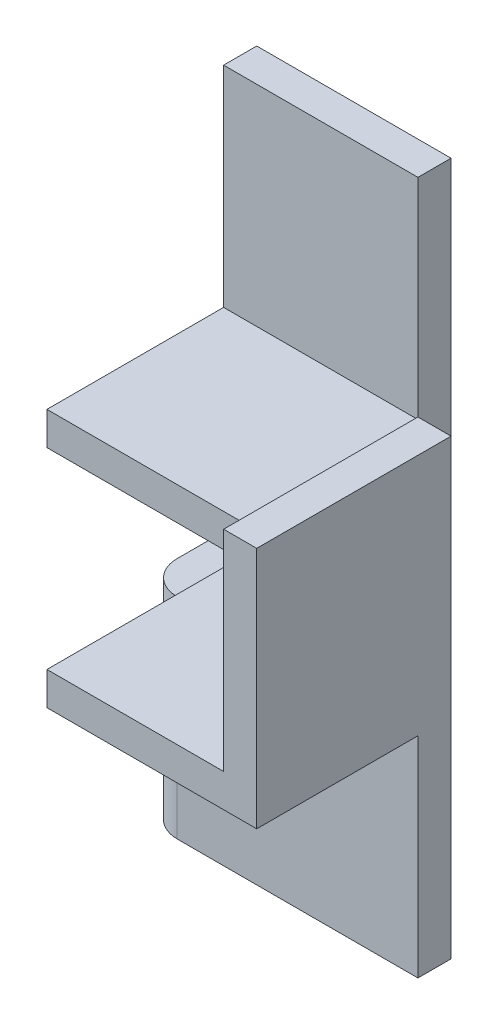
ISO-10303-21;
HEADER;
FILE_DESCRIPTION(('STEP AP214'),'2;1');
FILE_NAME('part.step','',(''),(''),'','','');
FILE_SCHEMA(('AUTOMOTIVE_DESIGN { 1 0 10303 214 1 1 1 1 }'));
ENDSEC;
DATA;
#1=APPLICATION_CONTEXT('core data for automotive mechanical design processes');
#2=APPLICATION_PROTOCOL_DEFINITION('international standard','automotive_design',2000,#1);
#3=PRODUCT_CONTEXT('',#1,'mechanical');
#4=PRODUCT('Part','Part','',(#3));
#5=PRODUCT_RELATED_PRODUCT_CATEGORY('part','',(#4));
#6=PRODUCT_DEFINITION_FORMATION('','',#4);
#7=PRODUCT_DEFINITION_CONTEXT('part definition',#1,'design');
#8=PRODUCT_DEFINITION('design','',#6,#7);
#9=PRODUCT_DEFINITION_SHAPE('','',#8);
#10=(LENGTH_UNIT() NAMED_UNIT(*) SI_UNIT(.MILLI.,.METRE.));
#11=(NAMED_UNIT(*) PLANE_ANGLE_UNIT() SI_UNIT($,.RADIAN.));
#12=(NAMED_UNIT(*) SI_UNIT($,.STERADIAN.) SOLID_ANGLE_UNIT());
#13=UNCERTAINTY_MEASURE_WITH_UNIT(LENGTH_MEASURE(1.E-05),#10,'distance_accuracy_value','');
#14=(GEOMETRIC_REPRESENTATION_CONTEXT(3) GLOBAL_UNCERTAINTY_ASSIGNED_CONTEXT((#13)) GLOBAL_UNIT_ASSIGNED_CONTEXT((#10,
#11,#12)) REPRESENTATION_CONTEXT('',''));
#15=CARTESIAN_POINT('',(0.,0.,0.));
#16=DIRECTION('',(0.,0.,1.));
#17=DIRECTION('',(1.,0.,0.));
#18=AXIS2_PLACEMENT_3D('',#15,#16,#17);
#19=CARTESIAN_POINT('',(0.,0.,0.));
#20=DIRECTION('',(0.,1.,0.));
#21=DIRECTION('',(0.,0.,1.));
#22=AXIS2_PLACEMENT_3D('',#19,#20,#21);
#23=PLANE('',#22);
#24=DIRECTION('',(0.,0.,-1.));
#25=VECTOR('',#24,1.);
#26=CARTESIAN_POINT('',(18.542,0.,0.));
#27=LINE('',#26,#25);
#28=CARTESIAN_POINT('',(18.542,0.,27.686));
#29=VERTEX_POINT('',#28);
#30=CARTESIAN_POINT('',(18.542,0.,24.13));
#31=VERTEX_POINT('',#30);
#32=EDGE_CURVE('E219',#29,#31,#27,.T.);
#33=ORIENTED_EDGE('',*,*,#32,.F.);
#34=CARTESIAN_POINT('',(22.352,0.,27.686));
#35=DIRECTION('',(0.,1.,0.));
#36=DIRECTION('',(0.,0.,1.));
#37=AXIS2_PLACEMENT_3D('',#34,#35,#36);
#38=CIRCLE('',#37,3.81);
#39=CARTESIAN_POINT('',(22.352,0.,31.496));
#40=VERTEX_POINT('',#39);
#41=EDGE_CURVE('E55',#29,#40,#38,.T.);
#42=ORIENTED_EDGE('',*,*,#41,.T.);
#43=DIRECTION('',(-1.,0.,0.));
#44=VECTOR('',#43,1.);
#45=CARTESIAN_POINT('',(50.038,0.,31.496));
#46=LINE('',#45,#44);
#47=CARTESIAN_POINT('',(25.908,0.,31.496));
#48=VERTEX_POINT('',#47);
#49=EDGE_CURVE('E235',#48,#40,#46,.T.);
#50=ORIENTED_EDGE('',*,*,#49,.F.);
#51=DIRECTION('',(0.,0.,1.));
#52=VECTOR('',#51,1.);
#53=CARTESIAN_POINT('',(25.908,0.,0.));
#54=LINE('',#53,#52);
#55=CARTESIAN_POINT('',(25.908,0.,27.686));
#56=VERTEX_POINT('',#55);
#57=EDGE_CURVE('E281',#56,#48,#54,.T.);
#58=ORIENTED_EDGE('',*,*,#57,.F.);
#59=DIRECTION('',(1.,0.,0.));
#60=VECTOR('',#59,1.);
#61=CARTESIAN_POINT('',(22.352,0.,27.686));
#62=LINE('',#61,#60);
#63=CARTESIAN_POINT('',(22.352,0.,27.686));
#64=VERTEX_POINT('',#63);
#65=EDGE_CURVE('E232',#64,#56,#62,.T.);
#66=ORIENTED_EDGE('',*,*,#65,.F.);
#67=DIRECTION('',(0.,0.,1.));
#68=VECTOR('',#67,1.);
#69=CARTESIAN_POINT('',(22.352,0.,0.));
#70=LINE('',#69,#68);
#71=CARTESIAN_POINT('',(22.352,0.,24.13));
#72=VERTEX_POINT('',#71);
#73=EDGE_CURVE('E214',#72,#64,#70,.T.);
#74=ORIENTED_EDGE('',*,*,#73,.F.);
#75=DIRECTION('',(1.,0.,0.));
#76=VECTOR('',#75,1.);
#77=CARTESIAN_POINT('',(0.,0.,24.13));
#78=LINE('',#77,#76);
#79=EDGE_CURVE('E200',#31,#72,#78,.T.);
#80=ORIENTED_EDGE('',*,*,#79,.F.);
#81=EDGE_LOOP('',(#33,#42,#50,#58,#66,#74,#80));
#82=FACE_BOUND('',#81,.T.);
#83=ADVANCED_FACE('F33',(#82),#23,.T.);
#84=CARTESIAN_POINT('',(0.,0.,0.));
#85=DIRECTION('',(0.,1.,0.));
#86=DIRECTION('',(0.,0.,1.));
#87=AXIS2_PLACEMENT_3D('',#84,#85,#86);
#88=PLANE('',#87);
#89=CARTESIAN_POINT('',(50.038,0.,31.496));
#90=VERTEX_POINT('',#89);
#91=EDGE_CURVE('E236',#90,#48,#46,.T.);
#92=ORIENTED_EDGE('',*,*,#91,.F.);
#93=DIRECTION('',(0.,0.,1.));
#94=VECTOR('',#93,1.);
#95=CARTESIAN_POINT('',(50.038,0.,0.));
#96=LINE('',#95,#94);
#97=CARTESIAN_POINT('',(50.038,0.,50.038));
#98=VERTEX_POINT('',#97);
#99=EDGE_CURVE('E269',#90,#98,#96,.T.);
#100=ORIENTED_EDGE('',*,*,#99,.T.);
#101=DIRECTION('',(1.,0.,0.));
#102=VECTOR('',#101,1.);
#103=CARTESIAN_POINT('',(0.,0.,50.038));
#104=LINE('',#103,#102);
#105=CARTESIAN_POINT('',(25.908,0.,50.038));
#106=VERTEX_POINT('',#105);
#107=EDGE_CURVE('E274',#106,#98,#104,.T.);
#108=ORIENTED_EDGE('',*,*,#107,.F.);
#109=EDGE_CURVE('E280',#48,#106,#54,.T.);
#110=ORIENTED_EDGE('',*,*,#109,.F.);
#111=EDGE_LOOP('',(#92,#100,#108,#110));
#112=FACE_BOUND('',#111,.T.);
#113=ADVANCED_FACE('F334',(#112),#88,.F.);
#114=CARTESIAN_POINT('',(50.038,3.81,0.));
#115=DIRECTION('',(1.,0.,0.));
#116=DIRECTION('',(0.,0.,-1.));
#117=AXIS2_PLACEMENT_3D('',#114,#115,#116);
#118=PLANE('',#117);
#119=ORIENTED_EDGE('',*,*,#99,.F.);
#120=DIRECTION('',(0.,1.,0.));
#121=VECTOR('',#120,1.);
#122=CARTESIAN_POINT('',(50.038,-24.13,31.496));
#123=LINE('',#122,#121);
#124=CARTESIAN_POINT('',(50.038,-24.13,31.496));
#125=VERTEX_POINT('',#124);
#126=EDGE_CURVE('E244',#125,#90,#123,.T.);
#127=ORIENTED_EDGE('',*,*,#126,.F.);
#128=DIRECTION('',(0.,0.,1.));
#129=VECTOR('',#128,1.);
#130=CARTESIAN_POINT('',(50.038,-24.13,27.686));
#131=LINE('',#130,#129);
#132=CARTESIAN_POINT('',(50.038,-24.13,27.686));
#133=VERTEX_POINT('',#132);
#134=EDGE_CURVE('E222',#133,#125,#131,.T.);
#135=ORIENTED_EDGE('',*,*,#134,.F.);
#136=DIRECTION('',(0.,-1.,0.));
#137=VECTOR('',#136,1.);
#138=CARTESIAN_POINT('',(50.038,3.81,27.686));
#139=LINE('',#138,#137);
#140=CARTESIAN_POINT('',(50.038,27.94,27.686));
#141=VERTEX_POINT('',#140);
#142=EDGE_CURVE('E292',#141,#133,#139,.T.);
#143=ORIENTED_EDGE('',*,*,#142,.F.);
#144=DIRECTION('',(0.,0.,-1.));
#145=VECTOR('',#144,1.);
#146=CARTESIAN_POINT('',(50.038,27.94,50.038));
#147=LINE('',#146,#145);
#148=CARTESIAN_POINT('',(50.038,27.94,50.038));
#149=VERTEX_POINT('',#148);
#150=EDGE_CURVE('E251',#149,#141,#147,.T.);
#151=ORIENTED_EDGE('',*,*,#150,.F.);
#152=DIRECTION('',(0.,-1.,0.));
#153=VECTOR('',#152,1.);
#154=CARTESIAN_POINT('',(50.038,3.81,50.038));
#155=LINE('',#154,#153);
#156=EDGE_CURVE('E278',#149,#98,#155,.T.);
#157=ORIENTED_EDGE('',*,*,#156,.T.);
#158=EDGE_LOOP('',(#119,#127,#135,#143,#151,#157));
#159=FACE_BOUND('',#158,.T.);
#160=ADVANCED_FACE('F339',(#159),#118,.T.);
#161=CARTESIAN_POINT('',(0.,3.81,27.686));
#162=DIRECTION('',(0.,0.,-1.));
#163=DIRECTION('',(-1.,0.,0.));
#164=AXIS2_PLACEMENT_3D('',#161,#162,#163);
#165=PLANE('',#164);
#166=ORIENTED_EDGE('',*,*,#142,.T.);
#167=DIRECTION('',(1.,0.,0.));
#168=VECTOR('',#167,1.);
#169=CARTESIAN_POINT('',(22.352,-24.13,27.686));
#170=LINE('',#169,#168);
#171=CARTESIAN_POINT('',(22.352,-24.13,27.686));
#172=VERTEX_POINT('',#171);
#173=EDGE_CURVE('E218',#172,#133,#170,.T.);
#174=ORIENTED_EDGE('',*,*,#173,.F.);
#175=DIRECTION('',(0.,1.,0.));
#176=VECTOR('',#175,1.);
#177=CARTESIAN_POINT('',(22.352,-24.13,27.686));
#178=LINE('',#177,#176);
#179=EDGE_CURVE('E247',#172,#64,#178,.T.);
#180=ORIENTED_EDGE('',*,*,#179,.T.);
#181=ORIENTED_EDGE('',*,*,#65,.T.);
#182=DIRECTION('',(0.,-1.,0.));
#183=VECTOR('',#182,1.);
#184=CARTESIAN_POINT('',(25.908,3.81,27.686));
#185=LINE('',#184,#183);
#186=CARTESIAN_POINT('',(25.908,3.81,27.686));
#187=VERTEX_POINT('',#186);
#188=EDGE_CURVE('E290',#187,#56,#185,.T.);
#189=ORIENTED_EDGE('',*,*,#188,.F.);
#190=DIRECTION('',(1.,0.,0.));
#191=VECTOR('',#190,1.);
#192=CARTESIAN_POINT('',(0.,3.81,27.686));
#193=LINE('',#192,#191);
#194=CARTESIAN_POINT('',(46.228,3.81,27.686));
#195=VERTEX_POINT('',#194);
#196=EDGE_CURVE('E270',#187,#195,#193,.T.);
#197=ORIENTED_EDGE('',*,*,#196,.T.);
#198=DIRECTION('',(0.,-1.,0.));
#199=VECTOR('',#198,1.);
#200=CARTESIAN_POINT('',(46.228,27.94,27.686));
#201=LINE('',#200,#199);
#202=CARTESIAN_POINT('',(46.228,27.94,27.686));
#203=VERTEX_POINT('',#202);
#204=EDGE_CURVE('E266',#203,#195,#201,.T.);
#205=ORIENTED_EDGE('',*,*,#204,.F.);
#206=DIRECTION('',(-1.,0.,0.));
#207=VECTOR('',#206,1.);
#208=CARTESIAN_POINT('',(50.038,27.94,27.686));
#209=LINE('',#208,#207);
#210=EDGE_CURVE('E254',#141,#203,#209,.T.);
#211=ORIENTED_EDGE('',*,*,#210,.F.);
#212=EDGE_LOOP('',(#166,#174,#180,#181,#189,#197,#205,#211));
#213=FACE_BOUND('',#212,.T.);
#214=ADVANCED_FACE('F373',(#213),#165,.T.);
#215=CARTESIAN_POINT('',(25.908,3.81,0.));
#216=DIRECTION('',(1.,0.,0.));
#217=DIRECTION('',(0.,0.,-1.));
#218=AXIS2_PLACEMENT_3D('',#215,#216,#217);
#219=PLANE('',#218);
#220=ORIENTED_EDGE('',*,*,#57,.T.);
#221=ORIENTED_EDGE('',*,*,#109,.T.);
#222=DIRECTION('',(0.,-1.,0.));
#223=VECTOR('',#222,1.);
#224=CARTESIAN_POINT('',(25.908,3.81,50.038));
#225=LINE('',#224,#223);
#226=CARTESIAN_POINT('',(25.908,3.81,50.038));
#227=VERTEX_POINT('',#226);
#228=EDGE_CURVE('E287',#227,#106,#225,.T.);
#229=ORIENTED_EDGE('',*,*,#228,.F.);
#230=DIRECTION('',(0.,0.,1.));
#231=VECTOR('',#230,1.);
#232=CARTESIAN_POINT('',(25.908,3.81,0.));
#233=LINE('',#232,#231);
#234=EDGE_CURVE('E273',#187,#227,#233,.T.);
#235=ORIENTED_EDGE('',*,*,#234,.F.);
#236=ORIENTED_EDGE('',*,*,#188,.T.);
#237=EDGE_LOOP('',(#220,#221,#229,#235,#236));
#238=FACE_BOUND('',#237,.T.);
#239=ADVANCED_FACE('F369',(#238),#219,.F.);
#240=CARTESIAN_POINT('',(0.,3.81,50.038));
#241=DIRECTION('',(0.,0.,-1.));
#242=DIRECTION('',(-1.,0.,0.));
#243=AXIS2_PLACEMENT_3D('',#240,#241,#242);
#244=PLANE('',#243);
#245=ORIENTED_EDGE('',*,*,#107,.T.);
#246=ORIENTED_EDGE('',*,*,#156,.F.);
#247=DIRECTION('',(1.,0.,0.));
#248=VECTOR('',#247,1.);
#249=CARTESIAN_POINT('',(50.038,27.94,50.038));
#250=LINE('',#249,#248);
#251=CARTESIAN_POINT('',(46.228,27.94,50.038));
#252=VERTEX_POINT('',#251);
#253=EDGE_CURVE('E258',#252,#149,#250,.T.);
#254=ORIENTED_EDGE('',*,*,#253,.F.);
#255=DIRECTION('',(0.,-1.,0.));
#256=VECTOR('',#255,1.);
#257=CARTESIAN_POINT('',(46.228,27.94,50.038));
#258=LINE('',#257,#256);
#259=CARTESIAN_POINT('',(46.228,3.81,50.038));
#260=VERTEX_POINT('',#259);
#261=EDGE_CURVE('E261',#252,#260,#258,.T.);
#262=ORIENTED_EDGE('',*,*,#261,.T.);
#263=DIRECTION('',(1.,0.,0.));
#264=VECTOR('',#263,1.);
#265=CARTESIAN_POINT('',(0.,3.81,50.038));
#266=LINE('',#265,#264);
#267=EDGE_CURVE('E276',#227,#260,#266,.T.);
#268=ORIENTED_EDGE('',*,*,#267,.F.);
#269=ORIENTED_EDGE('',*,*,#228,.T.);
#270=EDGE_LOOP('',(#245,#246,#254,#262,#268,#269));
#271=FACE_BOUND('',#270,.T.);
#272=ADVANCED_FACE('F364',(#271),#244,.F.);
#273=CARTESIAN_POINT('',(0.,3.81,0.));
#274=DIRECTION('',(0.,1.,0.));
#275=DIRECTION('',(0.,0.,1.));
#276=AXIS2_PLACEMENT_3D('',#273,#274,#275);
#277=PLANE('',#276);
#278=DIRECTION('',(0.,0.,1.));
#279=VECTOR('',#278,1.);
#280=CARTESIAN_POINT('',(46.228,3.81,50.038));
#281=LINE('',#280,#279);
#282=EDGE_CURVE('E250',#195,#260,#281,.T.);
#283=ORIENTED_EDGE('',*,*,#282,.F.);
#284=ORIENTED_EDGE('',*,*,#196,.F.);
#285=ORIENTED_EDGE('',*,*,#234,.T.);
#286=ORIENTED_EDGE('',*,*,#267,.T.);
#287=EDGE_LOOP('',(#283,#284,#285,#286));
#288=FACE_BOUND('',#287,.T.);
#289=ADVANCED_FACE('F361',(#288),#277,.T.);
#290=CARTESIAN_POINT('',(46.228,27.94,50.038));
#291=DIRECTION('',(1.,0.,0.));
#292=DIRECTION('',(0.,0.,-1.));
#293=AXIS2_PLACEMENT_3D('',#290,#291,#292);
#294=PLANE('',#293);
#295=ORIENTED_EDGE('',*,*,#282,.T.);
#296=ORIENTED_EDGE('',*,*,#261,.F.);
#297=DIRECTION('',(0.,0.,1.));
#298=VECTOR('',#297,1.);
#299=CARTESIAN_POINT('',(46.228,27.94,50.038));
#300=LINE('',#299,#298);
#301=EDGE_CURVE('E256',#203,#252,#300,.T.);
#302=ORIENTED_EDGE('',*,*,#301,.F.);
#303=ORIENTED_EDGE('',*,*,#204,.T.);
#304=EDGE_LOOP('',(#295,#296,#302,#303));
#305=FACE_BOUND('',#304,.T.);
#306=ADVANCED_FACE('F357',(#305),#294,.F.);
#307=CARTESIAN_POINT('',(0.,27.94,0.));
#308=DIRECTION('',(0.,1.,0.));
#309=DIRECTION('',(0.,0.,1.));
#310=AXIS2_PLACEMENT_3D('',#307,#308,#309);
#311=PLANE('',#310);
#312=ORIENTED_EDGE('',*,*,#150,.T.);
#313=ORIENTED_EDGE('',*,*,#210,.T.);
#314=ORIENTED_EDGE('',*,*,#301,.T.);
#315=ORIENTED_EDGE('',*,*,#253,.T.);
#316=EDGE_LOOP('',(#312,#313,#314,#315));
#317=FACE_BOUND('',#316,.T.);
#318=ADVANCED_FACE('F354',(#317),#311,.T.);
#319=CARTESIAN_POINT('',(22.352,-24.13,0.));
#320=DIRECTION('',(-1.,0.,0.));
#321=DIRECTION('',(0.,0.,1.));
#322=AXIS2_PLACEMENT_3D('',#319,#320,#321);
#323=PLANE('',#322);
#324=DIRECTION('',(0.,1.,0.));
#325=VECTOR('',#324,1.);
#326=CARTESIAN_POINT('',(22.352,-24.13,0.));
#327=LINE('',#326,#325);
#328=CARTESIAN_POINT('',(22.352,-24.13,0.));
#329=VERTEX_POINT('',#328);
#330=CARTESIAN_POINT('',(22.352,27.94,0.));
#331=VERTEX_POINT('',#330);
#332=EDGE_CURVE('E230',#329,#331,#327,.T.);
#333=ORIENTED_EDGE('',*,*,#332,.T.);
#334=DIRECTION('',(0.,0.,-1.));
#335=VECTOR('',#334,1.);
#336=CARTESIAN_POINT('',(22.352,27.94,0.));
#337=LINE('',#336,#335);
#338=CARTESIAN_POINT('',(22.352,27.94,3.81));
#339=VERTEX_POINT('',#338);
#340=EDGE_CURVE('E169',#339,#331,#337,.T.);
#341=ORIENTED_EDGE('',*,*,#340,.F.);
#342=DIRECTION('',(0.,-1.,0.));
#343=VECTOR('',#342,1.);
#344=CARTESIAN_POINT('',(22.352,27.94,3.81));
#345=LINE('',#344,#343);
#346=CARTESIAN_POINT('',(22.352,3.81,3.81));
#347=VERTEX_POINT('',#346);
#348=EDGE_CURVE('E165',#339,#347,#345,.T.);
#349=ORIENTED_EDGE('',*,*,#348,.T.);
#350=DIRECTION('',(0.,0.,1.));
#351=VECTOR('',#350,1.);
#352=CARTESIAN_POINT('',(22.352,3.81,0.));
#353=LINE('',#352,#351);
#354=CARTESIAN_POINT('',(22.352,3.81,24.13));
#355=VERTEX_POINT('',#354);
#356=EDGE_CURVE('E197',#347,#355,#353,.T.);
#357=ORIENTED_EDGE('',*,*,#356,.T.);
#358=DIRECTION('',(0.,-1.,0.));
#359=VECTOR('',#358,1.);
#360=CARTESIAN_POINT('',(22.352,3.81,24.13));
#361=LINE('',#360,#359);
#362=EDGE_CURVE('E188',#355,#72,#361,.T.);
#363=ORIENTED_EDGE('',*,*,#362,.T.);
#364=ORIENTED_EDGE('',*,*,#73,.T.);
#365=ORIENTED_EDGE('',*,*,#179,.F.);
#366=DIRECTION('',(0.,0.,1.));
#367=VECTOR('',#366,1.);
#368=CARTESIAN_POINT('',(22.352,-24.13,0.));
#369=LINE('',#368,#367);
#370=EDGE_CURVE('E215',#329,#172,#369,.T.);
#371=ORIENTED_EDGE('',*,*,#370,.F.);
#372=EDGE_LOOP('',(#333,#341,#349,#357,#363,#364,#365,#371));
#373=FACE_BOUND('',#372,.T.);
#374=ADVANCED_FACE('F313',(#373),#323,.F.);
#375=CARTESIAN_POINT('',(50.038,-24.13,31.496));
#376=DIRECTION('',(0.,0.,-1.));
#377=DIRECTION('',(-1.,0.,0.));
#378=AXIS2_PLACEMENT_3D('',#375,#376,#377);
#379=PLANE('',#378);
#380=ORIENTED_EDGE('',*,*,#49,.T.);
#381=DIRECTION('',(0.,1.,0.));
#382=VECTOR('',#381,1.);
#383=CARTESIAN_POINT('',(22.352,-24.13,31.496));
#384=LINE('',#383,#382);
#385=CARTESIAN_POINT('',(22.352,-24.13,31.496));
#386=VERTEX_POINT('',#385);
#387=EDGE_CURVE('E41',#40,#386,#384,.F.);
#388=ORIENTED_EDGE('',*,*,#387,.T.);
#389=DIRECTION('',(-1.,0.,0.));
#390=VECTOR('',#389,1.);
#391=CARTESIAN_POINT('',(50.038,-24.13,31.496));
#392=LINE('',#391,#390);
#393=EDGE_CURVE('E224',#125,#386,#392,.T.);
#394=ORIENTED_EDGE('',*,*,#393,.F.);
#395=ORIENTED_EDGE('',*,*,#126,.T.);
#396=ORIENTED_EDGE('',*,*,#91,.T.);
#397=EDGE_LOOP('',(#380,#388,#394,#395,#396));
#398=FACE_BOUND('',#397,.T.);
#399=ADVANCED_FACE('F349',(#398),#379,.F.);
#400=CARTESIAN_POINT('',(18.542,-24.13,0.));
#401=DIRECTION('',(1.,0.,0.));
#402=DIRECTION('',(0.,0.,-1.));
#403=AXIS2_PLACEMENT_3D('',#400,#401,#402);
#404=PLANE('',#403);
#405=DIRECTION('',(0.,0.,-1.));
#406=VECTOR('',#405,1.);
#407=CARTESIAN_POINT('',(18.542,-24.13,0.));
#408=LINE('',#407,#406);
#409=CARTESIAN_POINT('',(18.542,-24.13,27.686));
#410=VERTEX_POINT('',#409);
#411=CARTESIAN_POINT('',(18.542,-24.13,0.));
#412=VERTEX_POINT('',#411);
#413=EDGE_CURVE('E226',#410,#412,#408,.T.);
#414=ORIENTED_EDGE('',*,*,#413,.F.);
#415=DIRECTION('',(0.,1.,0.));
#416=VECTOR('',#415,1.);
#417=CARTESIAN_POINT('',(18.542,-24.13,27.686));
#418=LINE('',#417,#416);
#419=EDGE_CURVE('E294',#410,#29,#418,.T.);
#420=ORIENTED_EDGE('',*,*,#419,.T.);
#421=ORIENTED_EDGE('',*,*,#32,.T.);
#422=DIRECTION('',(0.,0.,1.));
#423=VECTOR('',#422,1.);
#424=CARTESIAN_POINT('',(18.542,0.,0.));
#425=LINE('',#424,#423);
#426=CARTESIAN_POINT('',(18.542,0.,0.));
#427=VERTEX_POINT('',#426);
#428=EDGE_CURVE('E206',#427,#31,#425,.T.);
#429=ORIENTED_EDGE('',*,*,#428,.F.);
#430=DIRECTION('',(0.,1.,0.));
#431=VECTOR('',#430,1.);
#432=CARTESIAN_POINT('',(18.542,-24.13,0.));
#433=LINE('',#432,#431);
#434=EDGE_CURVE('E241',#412,#427,#433,.T.);
#435=ORIENTED_EDGE('',*,*,#434,.F.);
#436=EDGE_LOOP('',(#414,#420,#421,#429,#435));
#437=FACE_BOUND('',#436,.T.);
#438=ADVANCED_FACE('F300',(#437),#404,.F.);
#439=CARTESIAN_POINT('',(22.352,-24.13,0.));
#440=DIRECTION('',(0.,0.,1.));
#441=DIRECTION('',(1.,0.,0.));
#442=AXIS2_PLACEMENT_3D('',#439,#440,#441);
#443=PLANE('',#442);
#444=ORIENTED_EDGE('',*,*,#434,.T.);
#445=DIRECTION('',(1.,0.,0.));
#446=VECTOR('',#445,1.);
#447=CARTESIAN_POINT('',(0.,0.,0.));
#448=LINE('',#447,#446);
#449=CARTESIAN_POINT('',(0.,0.,0.));
#450=VERTEX_POINT('',#449);
#451=EDGE_CURVE('E198',#450,#427,#448,.T.);
#452=ORIENTED_EDGE('',*,*,#451,.F.);
#453=DIRECTION('',(0.,-1.,0.));
#454=VECTOR('',#453,1.);
#455=CARTESIAN_POINT('',(0.,3.81,0.));
#456=LINE('',#455,#454);
#457=CARTESIAN_POINT('',(0.,27.94,0.));
#458=VERTEX_POINT('',#457);
#459=EDGE_CURVE('E195',#458,#450,#456,.T.);
#460=ORIENTED_EDGE('',*,*,#459,.F.);
#461=DIRECTION('',(-1.,0.,0.));
#462=VECTOR('',#461,1.);
#463=CARTESIAN_POINT('',(0.,27.94,0.));
#464=LINE('',#463,#462);
#465=EDGE_CURVE('E176',#331,#458,#464,.T.);
#466=ORIENTED_EDGE('',*,*,#465,.F.);
#467=ORIENTED_EDGE('',*,*,#332,.F.);
#468=DIRECTION('',(1.,0.,0.));
#469=VECTOR('',#468,1.);
#470=CARTESIAN_POINT('',(22.352,-24.13,0.));
#471=LINE('',#470,#469);
#472=EDGE_CURVE('E228',#412,#329,#471,.T.);
#473=ORIENTED_EDGE('',*,*,#472,.F.);
#474=EDGE_LOOP('',(#444,#452,#460,#466,#467,#473));
#475=FACE_BOUND('',#474,.T.);
#476=ADVANCED_FACE('F322',(#475),#443,.F.);
#477=CARTESIAN_POINT('',(0.,-24.13,0.));
#478=DIRECTION('',(0.,1.,0.));
#479=DIRECTION('',(0.,0.,1.));
#480=AXIS2_PLACEMENT_3D('',#477,#478,#479);
#481=PLANE('',#480);
#482=ORIENTED_EDGE('',*,*,#393,.T.);
#483=CARTESIAN_POINT('',(22.352,-24.13,27.686));
#484=DIRECTION('',(0.,1.,0.));
#485=DIRECTION('',(0.,0.,1.));
#486=AXIS2_PLACEMENT_3D('',#483,#484,#485);
#487=CIRCLE('',#486,3.81);
#488=EDGE_CURVE('E11',#386,#410,#487,.F.);
#489=ORIENTED_EDGE('',*,*,#488,.T.);
#490=ORIENTED_EDGE('',*,*,#413,.T.);
#491=ORIENTED_EDGE('',*,*,#472,.T.);
#492=ORIENTED_EDGE('',*,*,#370,.T.);
#493=ORIENTED_EDGE('',*,*,#173,.T.);
#494=ORIENTED_EDGE('',*,*,#134,.T.);
#495=EDGE_LOOP('',(#482,#489,#490,#491,#492,#493,#494));
#496=FACE_BOUND('',#495,.T.);
#497=ADVANCED_FACE('F327',(#496),#481,.F.);
#498=CARTESIAN_POINT('',(0.,0.,0.));
#499=DIRECTION('',(0.,1.,0.));
#500=DIRECTION('',(0.,0.,1.));
#501=AXIS2_PLACEMENT_3D('',#498,#499,#500);
#502=PLANE('',#501);
#503=ORIENTED_EDGE('',*,*,#451,.T.);
#504=ORIENTED_EDGE('',*,*,#428,.T.);
#505=CARTESIAN_POINT('',(0.,0.,24.13));
#506=VERTEX_POINT('',#505);
#507=EDGE_CURVE('E201',#506,#31,#78,.T.);
#508=ORIENTED_EDGE('',*,*,#507,.F.);
#509=DIRECTION('',(0.,0.,1.));
#510=VECTOR('',#509,1.);
#511=CARTESIAN_POINT('',(0.,0.,0.));
#512=LINE('',#511,#510);
#513=EDGE_CURVE('E204',#450,#506,#512,.T.);
#514=ORIENTED_EDGE('',*,*,#513,.F.);
#515=EDGE_LOOP('',(#503,#504,#508,#514));
#516=FACE_BOUND('',#515,.T.);
#517=ADVANCED_FACE('F320',(#516),#502,.F.);
#518=CARTESIAN_POINT('',(0.,3.81,0.));
#519=DIRECTION('',(1.,0.,0.));
#520=DIRECTION('',(0.,0.,-1.));
#521=AXIS2_PLACEMENT_3D('',#518,#519,#520);
#522=PLANE('',#521);
#523=ORIENTED_EDGE('',*,*,#513,.T.);
#524=DIRECTION('',(0.,-1.,0.));
#525=VECTOR('',#524,1.);
#526=CARTESIAN_POINT('',(0.,3.81,24.13));
#527=LINE('',#526,#525);
#528=CARTESIAN_POINT('',(0.,3.81,24.13));
#529=VERTEX_POINT('',#528);
#530=EDGE_CURVE('E185',#529,#506,#527,.T.);
#531=ORIENTED_EDGE('',*,*,#530,.F.);
#532=DIRECTION('',(0.,0.,1.));
#533=VECTOR('',#532,1.);
#534=CARTESIAN_POINT('',(0.,3.81,0.));
#535=LINE('',#534,#533);
#536=CARTESIAN_POINT('',(0.,3.81,3.81));
#537=VERTEX_POINT('',#536);
#538=EDGE_CURVE('E184',#537,#529,#535,.T.);
#539=ORIENTED_EDGE('',*,*,#538,.F.);
#540=DIRECTION('',(0.,-1.,0.));
#541=VECTOR('',#540,1.);
#542=CARTESIAN_POINT('',(0.,27.94,3.81));
#543=LINE('',#542,#541);
#544=CARTESIAN_POINT('',(0.,27.94,3.81));
#545=VERTEX_POINT('',#544);
#546=EDGE_CURVE('E163',#545,#537,#543,.T.);
#547=ORIENTED_EDGE('',*,*,#546,.F.);
#548=DIRECTION('',(0.,0.,1.));
#549=VECTOR('',#548,1.);
#550=CARTESIAN_POINT('',(0.,27.94,0.));
#551=LINE('',#550,#549);
#552=EDGE_CURVE('E170',#458,#545,#551,.T.);
#553=ORIENTED_EDGE('',*,*,#552,.F.);
#554=ORIENTED_EDGE('',*,*,#459,.T.);
#555=EDGE_LOOP('',(#523,#531,#539,#547,#553,#554));
#556=FACE_BOUND('',#555,.T.);
#557=ADVANCED_FACE('F182',(#556),#522,.F.);
#558=CARTESIAN_POINT('',(0.,3.81,24.13));
#559=DIRECTION('',(0.,0.,-1.));
#560=DIRECTION('',(-1.,0.,0.));
#561=AXIS2_PLACEMENT_3D('',#558,#559,#560);
#562=PLANE('',#561);
#563=ORIENTED_EDGE('',*,*,#507,.T.);
#564=ORIENTED_EDGE('',*,*,#79,.T.);
#565=ORIENTED_EDGE('',*,*,#362,.F.);
#566=DIRECTION('',(1.,0.,0.));
#567=VECTOR('',#566,1.);
#568=CARTESIAN_POINT('',(0.,3.81,24.13));
#569=LINE('',#568,#567);
#570=EDGE_CURVE('E208',#529,#355,#569,.T.);
#571=ORIENTED_EDGE('',*,*,#570,.F.);
#572=ORIENTED_EDGE('',*,*,#530,.T.);
#573=EDGE_LOOP('',(#563,#564,#565,#571,#572));
#574=FACE_BOUND('',#573,.T.);
#575=ADVANCED_FACE('F310',(#574),#562,.F.);
#576=CARTESIAN_POINT('',(0.,3.81,0.));
#577=DIRECTION('',(0.,1.,0.));
#578=DIRECTION('',(0.,0.,1.));
#579=AXIS2_PLACEMENT_3D('',#576,#577,#578);
#580=PLANE('',#579);
#581=DIRECTION('',(1.,0.,0.));
#582=VECTOR('',#581,1.);
#583=CARTESIAN_POINT('',(0.,3.81,3.81));
#584=LINE('',#583,#582);
#585=EDGE_CURVE('E178',#537,#347,#584,.T.);
#586=ORIENTED_EDGE('',*,*,#585,.F.);
#587=ORIENTED_EDGE('',*,*,#538,.T.);
#588=ORIENTED_EDGE('',*,*,#570,.T.);
#589=ORIENTED_EDGE('',*,*,#356,.F.);
#590=EDGE_LOOP('',(#586,#587,#588,#589));
#591=FACE_BOUND('',#590,.T.);
#592=ADVANCED_FACE('F316',(#591),#580,.T.);
#593=CARTESIAN_POINT('',(0.,27.94,3.81));
#594=DIRECTION('',(0.,0.,-1.));
#595=DIRECTION('',(-1.,0.,0.));
#596=AXIS2_PLACEMENT_3D('',#593,#594,#595);
#597=PLANE('',#596);
#598=ORIENTED_EDGE('',*,*,#585,.T.);
#599=ORIENTED_EDGE('',*,*,#348,.F.);
#600=DIRECTION('',(1.,0.,0.));
#601=VECTOR('',#600,1.);
#602=CARTESIAN_POINT('',(0.,27.94,3.81));
#603=LINE('',#602,#601);
#604=EDGE_CURVE('E158',#545,#339,#603,.T.);
#605=ORIENTED_EDGE('',*,*,#604,.F.);
#606=ORIENTED_EDGE('',*,*,#546,.T.);
#607=EDGE_LOOP('',(#598,#599,#605,#606));
#608=FACE_BOUND('',#607,.T.);
#609=ADVANCED_FACE('F161',(#608),#597,.F.);
#610=CARTESIAN_POINT('',(0.,27.94,0.));
#611=DIRECTION('',(0.,1.,0.));
#612=DIRECTION('',(0.,0.,1.));
#613=AXIS2_PLACEMENT_3D('',#610,#611,#612);
#614=PLANE('',#613);
#615=ORIENTED_EDGE('',*,*,#552,.T.);
#616=ORIENTED_EDGE('',*,*,#604,.T.);
#617=ORIENTED_EDGE('',*,*,#340,.T.);
#618=ORIENTED_EDGE('',*,*,#465,.T.);
#619=EDGE_LOOP('',(#615,#616,#617,#618));
#620=FACE_BOUND('',#619,.T.);
#621=ADVANCED_FACE('F174',(#620),#614,.T.);
#622=CARTESIAN_POINT('',(22.352,-24.13,27.686));
#623=DIRECTION('',(0.,1.,0.));
#624=DIRECTION('',(0.,0.,1.));
#625=AXIS2_PLACEMENT_3D('',#622,#623,#624);
#626=CYLINDRICAL_SURFACE('',#625,3.81);
#627=ORIENTED_EDGE('',*,*,#488,.F.);
#628=ORIENTED_EDGE('',*,*,#387,.F.);
#629=ORIENTED_EDGE('',*,*,#41,.F.);
#630=ORIENTED_EDGE('',*,*,#419,.F.);
#631=EDGE_LOOP('',(#627,#628,#629,#630));
#632=FACE_BOUND('',#631,.T.);
#633=ADVANCED_FACE('F35',(#632),#626,.T.);
#634=CLOSED_SHELL('',(#83,#113,#160,#214,#239,#272,#289,#306,#318,#374,#399,#438,#476,#497,#517,
#557,#575,#592,#609,#621,#633));
#635=MANIFOLD_SOLID_BREP('B2',#634);
#636=ADVANCED_BREP_SHAPE_REPRESENTATION('',(#18,#635),#14);
#637=SHAPE_DEFINITION_REPRESENTATION(#9,#636);
ENDSEC;
END-ISO-10303-21;
